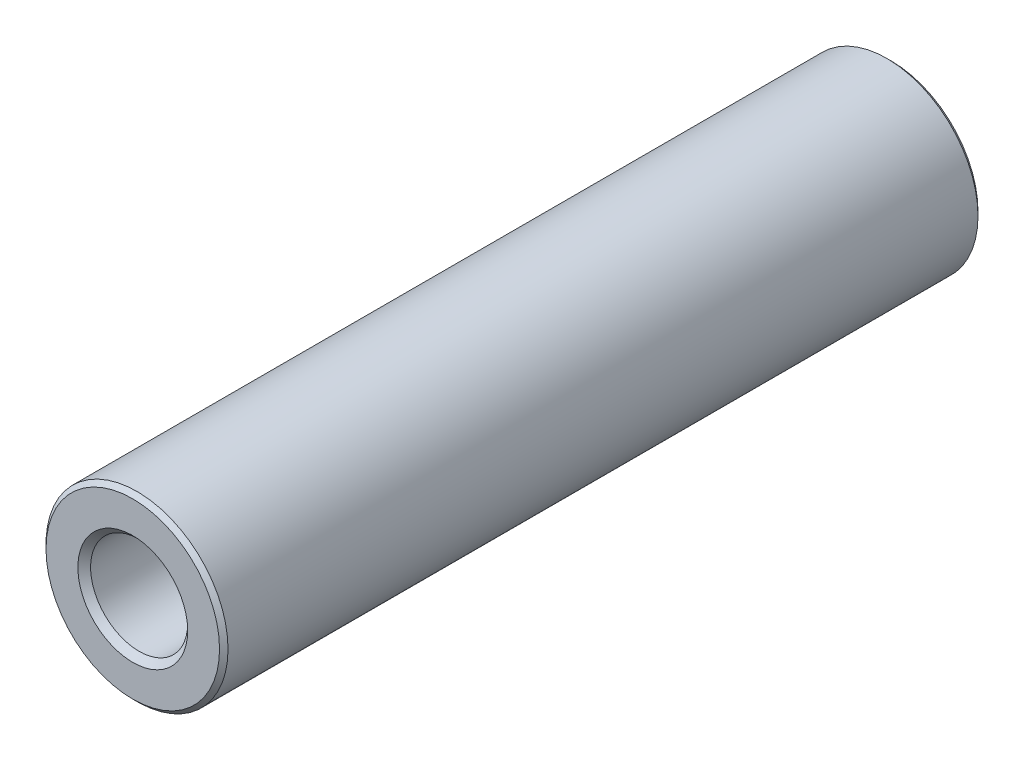
ISO-10303-21;
HEADER;
FILE_DESCRIPTION(('STEP AP214'),'2;1');
FILE_NAME('part.step','',(''),(''),'','','');
FILE_SCHEMA(('AUTOMOTIVE_DESIGN { 1 0 10303 214 1 1 1 1 }'));
ENDSEC;
DATA;
#1=APPLICATION_CONTEXT('core data for automotive mechanical design processes');
#2=APPLICATION_PROTOCOL_DEFINITION('international standard','automotive_design',2000,#1);
#3=PRODUCT_CONTEXT('',#1,'mechanical');
#4=PRODUCT('Part','Part','',(#3));
#5=PRODUCT_RELATED_PRODUCT_CATEGORY('part','',(#4));
#6=PRODUCT_DEFINITION_FORMATION('','',#4);
#7=PRODUCT_DEFINITION_CONTEXT('part definition',#1,'design');
#8=PRODUCT_DEFINITION('design','',#6,#7);
#9=PRODUCT_DEFINITION_SHAPE('','',#8);
#10=(LENGTH_UNIT() NAMED_UNIT(*) SI_UNIT(.MILLI.,.METRE.));
#11=(NAMED_UNIT(*) PLANE_ANGLE_UNIT() SI_UNIT($,.RADIAN.));
#12=(NAMED_UNIT(*) SI_UNIT($,.STERADIAN.) SOLID_ANGLE_UNIT());
#13=UNCERTAINTY_MEASURE_WITH_UNIT(LENGTH_MEASURE(1.E-05),#10,'distance_accuracy_value','');
#14=(GEOMETRIC_REPRESENTATION_CONTEXT(3) GLOBAL_UNCERTAINTY_ASSIGNED_CONTEXT((#13)) GLOBAL_UNIT_ASSIGNED_CONTEXT((#10,
#11,#12)) REPRESENTATION_CONTEXT('',''));
#15=CARTESIAN_POINT('',(0.,0.,0.));
#16=DIRECTION('',(0.,0.,1.));
#17=DIRECTION('',(1.,0.,0.));
#18=AXIS2_PLACEMENT_3D('',#15,#16,#17);
#19=CARTESIAN_POINT('',(0.,0.,-12.5));
#20=DIRECTION('',(0.,0.,1.));
#21=DIRECTION('',(1.,0.,0.));
#22=AXIS2_PLACEMENT_3D('',#19,#20,#21);
#23=CYLINDRICAL_SURFACE('',#22,3.);
#24=CARTESIAN_POINT('',(0.,0.,12.36));
#25=DIRECTION('',(0.,0.,1.));
#26=DIRECTION('',(1.,0.,0.));
#27=AXIS2_PLACEMENT_3D('',#24,#25,#26);
#28=CIRCLE('',#27,3.);
#29=CARTESIAN_POINT('',(3.,0.,12.36));
#30=VERTEX_POINT('',#29);
#31=EDGE_CURVE('E60',#30,#30,#28,.F.);
#32=ORIENTED_EDGE('',*,*,#31,.T.);
#33=EDGE_LOOP('',(#32));
#34=FACE_BOUND('',#33,.T.);
#35=CARTESIAN_POINT('',(0.,0.,-12.36));
#36=DIRECTION('',(0.,0.,1.));
#37=DIRECTION('',(1.,0.,0.));
#38=AXIS2_PLACEMENT_3D('',#35,#36,#37);
#39=CIRCLE('',#38,3.);
#40=CARTESIAN_POINT('',(3.,0.,-12.36));
#41=VERTEX_POINT('',#40);
#42=EDGE_CURVE('E63',#41,#41,#39,.T.);
#43=ORIENTED_EDGE('',*,*,#42,.T.);
#44=EDGE_LOOP('',(#43));
#45=FACE_BOUND('',#44,.T.);
#46=ADVANCED_FACE('F37',(#34,#45),#23,.T.);
#47=CARTESIAN_POINT('',(0.,0.,-12.5));
#48=DIRECTION('',(0.,0.,1.));
#49=DIRECTION('',(1.,0.,0.));
#50=AXIS2_PLACEMENT_3D('',#47,#48,#49);
#51=PLANE('',#50);
#52=CARTESIAN_POINT('',(0.,0.,-12.5));
#53=DIRECTION('',(0.,0.,1.));
#54=DIRECTION('',(1.,0.,0.));
#55=AXIS2_PLACEMENT_3D('',#52,#53,#54);
#56=CIRCLE('',#55,1.81);
#57=CARTESIAN_POINT('',(1.81,0.,-12.5));
#58=VERTEX_POINT('',#57);
#59=EDGE_CURVE('E10',#58,#58,#56,.T.);
#60=ORIENTED_EDGE('',*,*,#59,.T.);
#61=EDGE_LOOP('',(#60));
#62=FACE_BOUND('',#61,.T.);
#63=CARTESIAN_POINT('',(0.,0.,-12.5));
#64=DIRECTION('',(0.,0.,1.));
#65=DIRECTION('',(1.,0.,0.));
#66=AXIS2_PLACEMENT_3D('',#63,#64,#65);
#67=CIRCLE('',#66,2.86);
#68=CARTESIAN_POINT('',(2.86,0.,-12.5));
#69=VERTEX_POINT('',#68);
#70=EDGE_CURVE('E57',#69,#69,#67,.F.);
#71=ORIENTED_EDGE('',*,*,#70,.T.);
#72=EDGE_LOOP('',(#71));
#73=FACE_BOUND('',#72,.T.);
#74=ADVANCED_FACE('F89',(#62,#73),#51,.F.);
#75=CARTESIAN_POINT('',(0.,0.,-12.5));
#76=DIRECTION('',(0.,0.,1.));
#77=DIRECTION('',(1.,0.,0.));
#78=AXIS2_PLACEMENT_3D('',#75,#76,#77);
#79=CYLINDRICAL_SURFACE('',#78,1.6);
#80=CARTESIAN_POINT('',(0.,0.,12.29));
#81=DIRECTION('',(0.,0.,1.));
#82=DIRECTION('',(1.,0.,0.));
#83=AXIS2_PLACEMENT_3D('',#80,#81,#82);
#84=CIRCLE('',#83,1.6);
#85=CARTESIAN_POINT('',(1.6,0.,12.29));
#86=VERTEX_POINT('',#85);
#87=EDGE_CURVE('E48',#86,#86,#84,.T.);
#88=CARTESIAN_POINT('',(0.,0.,-12.29));
#89=DIRECTION('',(0.,0.,1.));
#90=DIRECTION('',(1.,0.,0.));
#91=AXIS2_PLACEMENT_3D('',#88,#89,#90);
#92=CIRCLE('',#91,1.6);
#93=CARTESIAN_POINT('',(1.6,0.,-12.29));
#94=VERTEX_POINT('',#93);
#95=EDGE_CURVE('E52',#94,#94,#92,.F.);
#96=CARTESIAN_POINT('',(1.6,0.,12.29));
#97=CARTESIAN_POINT('',(1.6,0.,12.0339583333333));
#98=CARTESIAN_POINT('',(1.6,0.,11.7779166666667));
#99=CARTESIAN_POINT('',(1.6,0.,11.2658333333333));
#100=CARTESIAN_POINT('',(1.6,0.,11.0097916666667));
#101=CARTESIAN_POINT('',(1.6,0.,10.4977083333333));
#102=CARTESIAN_POINT('',(1.6,0.,10.2416666666667));
#103=CARTESIAN_POINT('',(1.6,0.,9.72958333333334));
#104=CARTESIAN_POINT('',(1.6,0.,9.47354166666667));
#105=CARTESIAN_POINT('',(1.6,0.,8.96145833333334));
#106=CARTESIAN_POINT('',(1.6,0.,8.70541666666667));
#107=CARTESIAN_POINT('',(1.6,0.,8.19333333333334));
#108=CARTESIAN_POINT('',(1.6,0.,7.93729166666667));
#109=CARTESIAN_POINT('',(1.6,0.,7.42520833333334));
#110=CARTESIAN_POINT('',(1.6,0.,7.16916666666667));
#111=CARTESIAN_POINT('',(1.6,0.,6.65708333333334));
#112=CARTESIAN_POINT('',(1.6,0.,6.40104166666667));
#113=CARTESIAN_POINT('',(1.6,0.,5.88895833333334));
#114=CARTESIAN_POINT('',(1.6,0.,5.63291666666667));
#115=CARTESIAN_POINT('',(1.6,0.,5.12083333333334));
#116=CARTESIAN_POINT('',(1.6,0.,4.86479166666667));
#117=CARTESIAN_POINT('',(1.6,0.,4.35270833333334));
#118=CARTESIAN_POINT('',(1.6,0.,4.09666666666667));
#119=CARTESIAN_POINT('',(1.6,0.,3.58458333333334));
#120=CARTESIAN_POINT('',(1.6,0.,3.32854166666667));
#121=CARTESIAN_POINT('',(1.6,0.,2.81645833333334));
#122=CARTESIAN_POINT('',(1.6,0.,2.56041666666667));
#123=CARTESIAN_POINT('',(1.6,0.,2.04833333333334));
#124=CARTESIAN_POINT('',(1.6,0.,1.79229166666667));
#125=CARTESIAN_POINT('',(1.6,0.,1.28020833333334));
#126=CARTESIAN_POINT('',(1.6,0.,1.02416666666667));
#127=CARTESIAN_POINT('',(1.6,0.,0.512083333333337));
#128=CARTESIAN_POINT('',(1.6,0.,0.25604166666667));
#129=CARTESIAN_POINT('',(1.6,0.,-0.256041666666663));
#130=CARTESIAN_POINT('',(1.6,0.,-0.51208333333333));
#131=CARTESIAN_POINT('',(1.6,0.,-1.02416666666666));
#132=CARTESIAN_POINT('',(1.6,0.,-1.28020833333333));
#133=CARTESIAN_POINT('',(1.6,0.,-1.79229166666666));
#134=CARTESIAN_POINT('',(1.6,0.,-2.04833333333333));
#135=CARTESIAN_POINT('',(1.6,0.,-2.56041666666666));
#136=CARTESIAN_POINT('',(1.6,0.,-2.81645833333333));
#137=CARTESIAN_POINT('',(1.6,0.,-3.32854166666666));
#138=CARTESIAN_POINT('',(1.6,0.,-3.58458333333333));
#139=CARTESIAN_POINT('',(1.6,0.,-4.09666666666666));
#140=CARTESIAN_POINT('',(1.6,0.,-4.35270833333333));
#141=CARTESIAN_POINT('',(1.6,0.,-4.86479166666666));
#142=CARTESIAN_POINT('',(1.6,0.,-5.12083333333333));
#143=CARTESIAN_POINT('',(1.6,0.,-5.63291666666666));
#144=CARTESIAN_POINT('',(1.6,0.,-5.88895833333333));
#145=CARTESIAN_POINT('',(1.6,0.,-6.40104166666667));
#146=CARTESIAN_POINT('',(1.6,0.,-6.65708333333333));
#147=CARTESIAN_POINT('',(1.6,0.,-7.16916666666666));
#148=CARTESIAN_POINT('',(1.6,0.,-7.42520833333333));
#149=CARTESIAN_POINT('',(1.6,0.,-7.93729166666666));
#150=CARTESIAN_POINT('',(1.6,0.,-8.19333333333333));
#151=CARTESIAN_POINT('',(1.6,0.,-8.70541666666666));
#152=CARTESIAN_POINT('',(1.6,0.,-8.96145833333333));
#153=CARTESIAN_POINT('',(1.6,0.,-9.47354166666667));
#154=CARTESIAN_POINT('',(1.6,0.,-9.72958333333333));
#155=CARTESIAN_POINT('',(1.6,0.,-10.2416666666667));
#156=CARTESIAN_POINT('',(1.6,0.,-10.4977083333333));
#157=CARTESIAN_POINT('',(1.6,0.,-11.0097916666667));
#158=CARTESIAN_POINT('',(1.6,0.,-11.2658333333333));
#159=CARTESIAN_POINT('',(1.6,0.,-11.7779166666667));
#160=CARTESIAN_POINT('',(1.6,0.,-12.0339583333333));
#161=CARTESIAN_POINT('',(1.6,0.,-12.29));
#162=B_SPLINE_CURVE_WITH_KNOTS('',3,(#96,#97,#98,#99,#100,#101,#102,#103,#104,#105,#106,#107,
#108,#109,#110,#111,#112,#113,#114,#115,#116,#117,#118,#119,#120,#121,#122,#123,#124,#125,#126,
#127,#128,#129,#130,#131,#132,#133,#134,#135,#136,#137,#138,#139,#140,#141,#142,#143,#144,#145,
#146,#147,#148,#149,#150,#151,#152,#153,#154,#155,#156,#157,#158,#159,#160,#161),.UNSPECIFIED.,
.F.,.F.,(4,2,2,2,2,2,2,2,2,2,2,2,2,2,2,2,2,2,2,2,2,2,2,2,2,2,2,2,2,2,2,2,4),(0.,
0.768125000000002,1.53625,2.304375,3.0725,3.840625,4.60875,5.376875,6.145,6.913125,7.68125,
8.449375,9.2175,9.985625,10.75375,11.521875,12.29,13.058125,13.82625,14.594375,15.3625,
16.130625,16.89875,17.666875,18.435,19.203125,19.97125,20.739375,21.5075,22.275625,23.04375,
23.811875,24.58),.UNSPECIFIED.);
#163=EDGE_CURVE('BSEAM84',#86,#94,#162,.T.);
#164=ORIENTED_EDGE('',*,*,#87,.T.);
#165=ORIENTED_EDGE('',*,*,#95,.T.);
#166=ORIENTED_EDGE('',*,*,#163,.T.);
#167=ORIENTED_EDGE('',*,*,#163,.F.);
#168=EDGE_LOOP('',(#164,#166,#165,#167));
#169=FACE_BOUND('',#168,.T.);
#170=ADVANCED_FACE('F84',(#169),#79,.F.);
#171=CARTESIAN_POINT('',(0.,0.,12.5));
#172=DIRECTION('',(0.,0.,1.));
#173=DIRECTION('',(1.,0.,0.));
#174=AXIS2_PLACEMENT_3D('',#171,#172,#173);
#175=PLANE('',#174);
#176=CARTESIAN_POINT('',(0.,0.,12.5));
#177=DIRECTION('',(0.,0.,1.));
#178=DIRECTION('',(1.,0.,0.));
#179=AXIS2_PLACEMENT_3D('',#176,#177,#178);
#180=CIRCLE('',#179,1.81);
#181=CARTESIAN_POINT('',(1.80999999999999,0.,12.5));
#182=VERTEX_POINT('',#181);
#183=EDGE_CURVE('E44',#182,#182,#180,.F.);
#184=ORIENTED_EDGE('',*,*,#183,.T.);
#185=EDGE_LOOP('',(#184));
#186=FACE_BOUND('',#185,.T.);
#187=CARTESIAN_POINT('',(0.,0.,12.5));
#188=DIRECTION('',(0.,0.,1.));
#189=DIRECTION('',(1.,0.,0.));
#190=AXIS2_PLACEMENT_3D('',#187,#188,#189);
#191=CIRCLE('',#190,2.86);
#192=CARTESIAN_POINT('',(2.86,0.,12.5));
#193=VERTEX_POINT('',#192);
#194=EDGE_CURVE('E66',#193,#193,#191,.T.);
#195=ORIENTED_EDGE('',*,*,#194,.T.);
#196=EDGE_LOOP('',(#195));
#197=FACE_BOUND('',#196,.T.);
#198=ADVANCED_FACE('F70',(#186,#197),#175,.T.);
#199=CARTESIAN_POINT('',(0.,0.,12.5));
#200=DIRECTION('',(0.,0.,-1.));
#201=DIRECTION('',(-1.,0.,0.));
#202=AXIS2_PLACEMENT_3D('',#199,#200,#201);
#203=CONICAL_SURFACE('',#202,2.86,0.785398163397439);
#204=ORIENTED_EDGE('',*,*,#31,.F.);
#205=EDGE_LOOP('',(#204));
#206=FACE_BOUND('',#205,.T.);
#207=ORIENTED_EDGE('',*,*,#194,.F.);
#208=EDGE_LOOP('',(#207));
#209=FACE_BOUND('',#208,.T.);
#210=ADVANCED_FACE('F72',(#206,#209),#203,.T.);
#211=CARTESIAN_POINT('',(0.,0.,-12.36));
#212=DIRECTION('',(0.,0.,1.));
#213=DIRECTION('',(1.,0.,0.));
#214=AXIS2_PLACEMENT_3D('',#211,#212,#213);
#215=CONICAL_SURFACE('',#214,3.,0.785398163397453);
#216=ORIENTED_EDGE('',*,*,#70,.F.);
#217=EDGE_LOOP('',(#216));
#218=FACE_BOUND('',#217,.T.);
#219=ORIENTED_EDGE('',*,*,#42,.F.);
#220=EDGE_LOOP('',(#219));
#221=FACE_BOUND('',#220,.T.);
#222=ADVANCED_FACE('F74',(#218,#221),#215,.T.);
#223=CARTESIAN_POINT('',(0.,0.,12.29));
#224=DIRECTION('',(0.,0.,1.));
#225=DIRECTION('',(1.,0.,0.));
#226=AXIS2_PLACEMENT_3D('',#223,#224,#225);
#227=CONICAL_SURFACE('',#226,1.6,0.78539816339745);
#228=CARTESIAN_POINT('',(1.80999999999999,0.,12.5));
#229=CARTESIAN_POINT('',(1.80781249999999,0.,12.4978125));
#230=CARTESIAN_POINT('',(1.80562499999999,0.,12.495625));
#231=CARTESIAN_POINT('',(1.80124999999999,0.,12.49125));
#232=CARTESIAN_POINT('',(1.7990625,0.,12.4890625));
#233=CARTESIAN_POINT('',(1.7946875,0.,12.4846875));
#234=CARTESIAN_POINT('',(1.7925,0.,12.4825));
#235=CARTESIAN_POINT('',(1.788125,0.,12.478125));
#236=CARTESIAN_POINT('',(1.7859375,0.,12.4759375));
#237=CARTESIAN_POINT('',(1.7815625,0.,12.4715625));
#238=CARTESIAN_POINT('',(1.779375,0.,12.469375));
#239=CARTESIAN_POINT('',(1.775,0.,12.465));
#240=CARTESIAN_POINT('',(1.7728125,0.,12.4628125));
#241=CARTESIAN_POINT('',(1.7684375,0.,12.4584375));
#242=CARTESIAN_POINT('',(1.76625,0.,12.45625));
#243=CARTESIAN_POINT('',(1.761875,0.,12.451875));
#244=CARTESIAN_POINT('',(1.7596875,0.,12.4496875));
#245=CARTESIAN_POINT('',(1.7553125,0.,12.4453125));
#246=CARTESIAN_POINT('',(1.753125,0.,12.443125));
#247=CARTESIAN_POINT('',(1.74875,0.,12.43875));
#248=CARTESIAN_POINT('',(1.7465625,0.,12.4365625));
#249=CARTESIAN_POINT('',(1.7421875,0.,12.4321875));
#250=CARTESIAN_POINT('',(1.74,0.,12.43));
#251=CARTESIAN_POINT('',(1.735625,0.,12.425625));
#252=CARTESIAN_POINT('',(1.7334375,0.,12.4234375));
#253=CARTESIAN_POINT('',(1.7290625,0.,12.4190625));
#254=CARTESIAN_POINT('',(1.726875,0.,12.416875));
#255=CARTESIAN_POINT('',(1.7225,0.,12.4125));
#256=CARTESIAN_POINT('',(1.7203125,0.,12.4103125));
#257=CARTESIAN_POINT('',(1.7159375,0.,12.4059375));
#258=CARTESIAN_POINT('',(1.71375,0.,12.40375));
#259=CARTESIAN_POINT('',(1.709375,0.,12.399375));
#260=CARTESIAN_POINT('',(1.7071875,0.,12.3971875));
#261=CARTESIAN_POINT('',(1.7028125,0.,12.3928125));
#262=CARTESIAN_POINT('',(1.700625,0.,12.390625));
#263=CARTESIAN_POINT('',(1.69625,0.,12.38625));
#264=CARTESIAN_POINT('',(1.6940625,0.,12.3840625));
#265=CARTESIAN_POINT('',(1.6896875,0.,12.3796875));
#266=CARTESIAN_POINT('',(1.6875,0.,12.3775));
#267=CARTESIAN_POINT('',(1.683125,0.,12.373125));
#268=CARTESIAN_POINT('',(1.6809375,0.,12.3709375));
#269=CARTESIAN_POINT('',(1.6765625,0.,12.3665625));
#270=CARTESIAN_POINT('',(1.674375,0.,12.364375));
#271=CARTESIAN_POINT('',(1.67,0.,12.36));
#272=CARTESIAN_POINT('',(1.6678125,0.,12.3578125));
#273=CARTESIAN_POINT('',(1.6634375,0.,12.3534375));
#274=CARTESIAN_POINT('',(1.66125,0.,12.35125));
#275=CARTESIAN_POINT('',(1.656875,0.,12.346875));
#276=CARTESIAN_POINT('',(1.6546875,0.,12.3446875));
#277=CARTESIAN_POINT('',(1.6503125,0.,12.3403125));
#278=CARTESIAN_POINT('',(1.648125,0.,12.338125));
#279=CARTESIAN_POINT('',(1.64375,0.,12.33375));
#280=CARTESIAN_POINT('',(1.6415625,0.,12.3315625));
#281=CARTESIAN_POINT('',(1.6371875,0.,12.3271875));
#282=CARTESIAN_POINT('',(1.635,0.,12.325));
#283=CARTESIAN_POINT('',(1.630625,0.,12.320625));
#284=CARTESIAN_POINT('',(1.6284375,0.,12.3184375));
#285=CARTESIAN_POINT('',(1.6240625,0.,12.3140625));
#286=CARTESIAN_POINT('',(1.621875,0.,12.311875));
#287=CARTESIAN_POINT('',(1.6175,0.,12.3075));
#288=CARTESIAN_POINT('',(1.6153125,0.,12.3053125));
#289=CARTESIAN_POINT('',(1.6109375,0.,12.3009375));
#290=CARTESIAN_POINT('',(1.60875,0.,12.29875));
#291=CARTESIAN_POINT('',(1.604375,0.,12.294375));
#292=CARTESIAN_POINT('',(1.6021875,0.,12.2921875));
#293=CARTESIAN_POINT('',(1.6,0.,12.29));
#294=B_SPLINE_CURVE_WITH_KNOTS('',3,(#228,#229,#230,#231,#232,#233,#234,#235,#236,#237,#238,
#239,#240,#241,#242,#243,#244,#245,#246,#247,#248,#249,#250,#251,#252,#253,#254,#255,#256,#257,
#258,#259,#260,#261,#262,#263,#264,#265,#266,#267,#268,#269,#270,#271,#272,#273,#274,#275,#276,
#277,#278,#279,#280,#281,#282,#283,#284,#285,#286,#287,#288,#289,#290,#291,#292,#293),
.UNSPECIFIED.,.F.,.F.,(4,2,2,2,2,2,2,2,2,2,2,2,2,2,2,2,2,2,2,2,2,2,2,2,2,2,2,2,2,2,2,2,4),(0.,
0.00928077650307306,0.0185615530061461,0.0278423295092192,0.0371231060122922,0.0464038825153654,
0.0556846590184383,0.0649654355215116,0.0742462120245859,0.0835269885276589,0.092807765030732,
0.102088541533805,0.111369318036878,0.120650094539951,0.129930871043024,0.139211647546097,
0.148492424049172,0.157773200552245,0.167053977055318,0.176334753558391,0.185615530061464,
0.194896306564537,0.20417708306761,0.213457859570683,0.222738636073757,0.232019412576831,
0.241300189079904,0.250580965582977,0.25986174208605,0.269142518589123,0.278423295092196,
0.287704071595269,0.296984848098342),.UNSPECIFIED.);
#295=EDGE_CURVE('BSEAM81',#182,#86,#294,.T.);
#296=ORIENTED_EDGE('',*,*,#183,.F.);
#297=ORIENTED_EDGE('',*,*,#87,.F.);
#298=ORIENTED_EDGE('',*,*,#295,.T.);
#299=ORIENTED_EDGE('',*,*,#295,.F.);
#300=EDGE_LOOP('',(#296,#298,#297,#299));
#301=FACE_BOUND('',#300,.T.);
#302=ADVANCED_FACE('F81',(#301),#227,.F.);
#303=CARTESIAN_POINT('',(0.,0.,-12.5));
#304=DIRECTION('',(0.,0.,-1.));
#305=DIRECTION('',(-1.,0.,0.));
#306=AXIS2_PLACEMENT_3D('',#303,#304,#305);
#307=CONICAL_SURFACE('',#306,1.81,0.785398163397442);
#308=ORIENTED_EDGE('',*,*,#95,.F.);
#309=EDGE_LOOP('',(#308));
#310=FACE_BOUND('',#309,.T.);
#311=ORIENTED_EDGE('',*,*,#59,.F.);
#312=EDGE_LOOP('',(#311));
#313=FACE_BOUND('',#312,.T.);
#314=ADVANCED_FACE('F39',(#310,#313),#307,.F.);
#315=CLOSED_SHELL('',(#46,#74,#170,#198,#210,#222,#302,#314));
#316=MANIFOLD_SOLID_BREP('B2',#315);
#317=ADVANCED_BREP_SHAPE_REPRESENTATION('',(#18,#316),#14);
#318=SHAPE_DEFINITION_REPRESENTATION(#9,#317);
ENDSEC;
END-ISO-10303-21;
